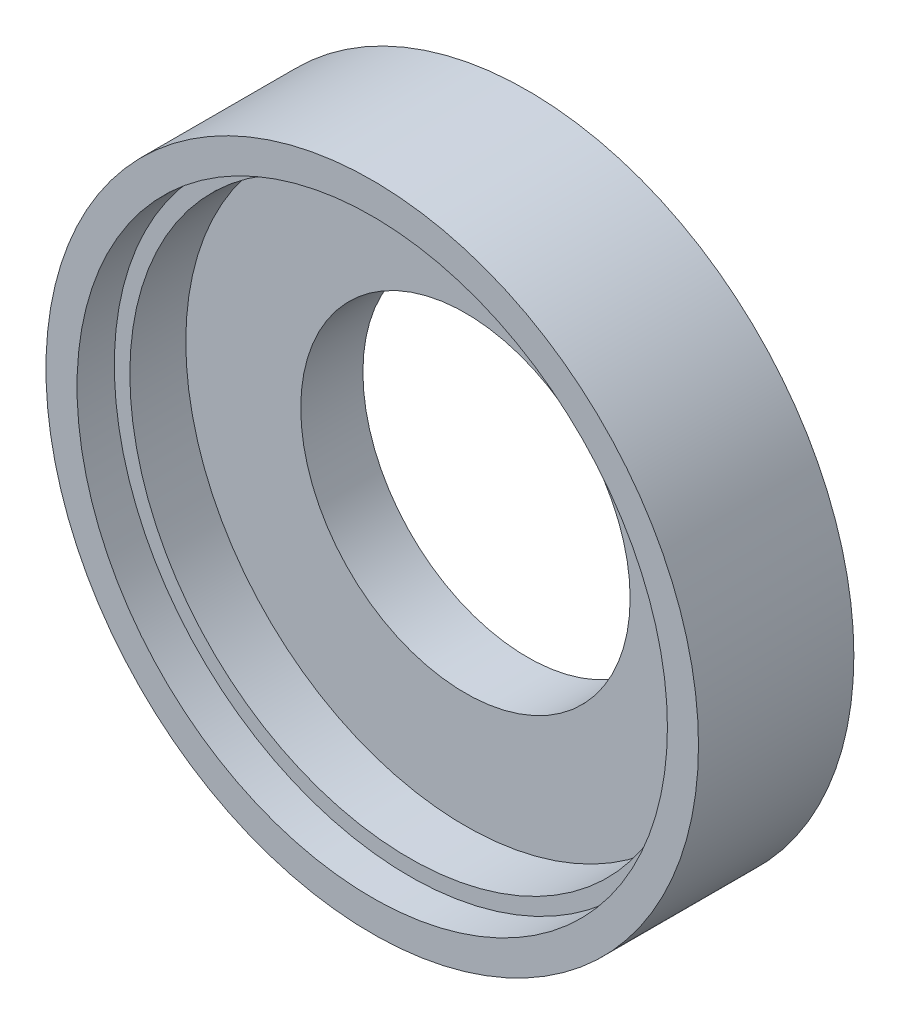
ISO-10303-21;
HEADER;
FILE_DESCRIPTION(('STEP AP214'),'2;1');
FILE_NAME('part.step','',(''),(''),'','','');
FILE_SCHEMA(('AUTOMOTIVE_DESIGN { 1 0 10303 214 1 1 1 1 }'));
ENDSEC;
DATA;
#1=APPLICATION_CONTEXT('core data for automotive mechanical design processes');
#2=APPLICATION_PROTOCOL_DEFINITION('international standard','automotive_design',2000,#1);
#3=PRODUCT_CONTEXT('',#1,'mechanical');
#4=PRODUCT('Part','Part','',(#3));
#5=PRODUCT_RELATED_PRODUCT_CATEGORY('part','',(#4));
#6=PRODUCT_DEFINITION_FORMATION('','',#4);
#7=PRODUCT_DEFINITION_CONTEXT('part definition',#1,'design');
#8=PRODUCT_DEFINITION('design','',#6,#7);
#9=PRODUCT_DEFINITION_SHAPE('','',#8);
#10=(LENGTH_UNIT() NAMED_UNIT(*) SI_UNIT(.MILLI.,.METRE.));
#11=(NAMED_UNIT(*) PLANE_ANGLE_UNIT() SI_UNIT($,.RADIAN.));
#12=(NAMED_UNIT(*) SI_UNIT($,.STERADIAN.) SOLID_ANGLE_UNIT());
#13=UNCERTAINTY_MEASURE_WITH_UNIT(LENGTH_MEASURE(1.E-05),#10,'distance_accuracy_value','');
#14=(GEOMETRIC_REPRESENTATION_CONTEXT(3) GLOBAL_UNCERTAINTY_ASSIGNED_CONTEXT((#13)) GLOBAL_UNIT_ASSIGNED_CONTEXT((#10,
#11,#12)) REPRESENTATION_CONTEXT('',''));
#15=CARTESIAN_POINT('',(0.,0.,0.));
#16=DIRECTION('',(0.,0.,1.));
#17=DIRECTION('',(1.,0.,0.));
#18=AXIS2_PLACEMENT_3D('',#15,#16,#17);
#19=CARTESIAN_POINT('',(0.,0.,25.));
#20=DIRECTION('',(0.,0.,-1.));
#21=DIRECTION('',(-1.,0.,0.));
#22=AXIS2_PLACEMENT_3D('',#19,#20,#21);
#23=CYLINDRICAL_SURFACE('',#22,47.5);
#24=CARTESIAN_POINT('',(0.,0.,19.));
#25=DIRECTION('',(0.,0.,1.));
#26=DIRECTION('',(1.,0.,0.));
#27=AXIS2_PLACEMENT_3D('',#24,#25,#26);
#28=CIRCLE('',#27,47.5);
#29=CARTESIAN_POINT('',(47.5,0.,19.));
#30=VERTEX_POINT('',#29);
#31=EDGE_CURVE('E43',#30,#30,#28,.T.);
#32=ORIENTED_EDGE('',*,*,#31,.F.);
#33=EDGE_LOOP('',(#32));
#34=FACE_BOUND('',#33,.T.);
#35=CARTESIAN_POINT('',(0.,0.,25.));
#36=DIRECTION('',(0.,0.,1.));
#37=DIRECTION('',(1.,0.,0.));
#38=AXIS2_PLACEMENT_3D('',#35,#36,#37);
#39=CIRCLE('',#38,47.5);
#40=CARTESIAN_POINT('',(47.5,0.,25.));
#41=VERTEX_POINT('',#40);
#42=EDGE_CURVE('E51',#41,#41,#39,.T.);
#43=ORIENTED_EDGE('',*,*,#42,.T.);
#44=EDGE_LOOP('',(#43));
#45=FACE_BOUND('',#44,.T.);
#46=ADVANCED_FACE('F37',(#34,#45),#23,.F.);
#47=CARTESIAN_POINT('',(0.,0.,25.));
#48=DIRECTION('',(0.,0.,-1.));
#49=DIRECTION('',(-1.,0.,0.));
#50=AXIS2_PLACEMENT_3D('',#47,#48,#49);
#51=CYLINDRICAL_SURFACE('',#50,52.5);
#52=CARTESIAN_POINT('',(0.,0.,25.));
#53=DIRECTION('',(0.,0.,1.));
#54=DIRECTION('',(1.,0.,0.));
#55=AXIS2_PLACEMENT_3D('',#52,#53,#54);
#56=CIRCLE('',#55,52.5);
#57=CARTESIAN_POINT('',(52.5,0.,25.));
#58=VERTEX_POINT('',#57);
#59=EDGE_CURVE('E47',#58,#58,#56,.T.);
#60=ORIENTED_EDGE('',*,*,#59,.F.);
#61=EDGE_LOOP('',(#60));
#62=FACE_BOUND('',#61,.T.);
#63=CARTESIAN_POINT('',(0.,0.,0.));
#64=DIRECTION('',(0.,0.,1.));
#65=DIRECTION('',(1.,0.,0.));
#66=AXIS2_PLACEMENT_3D('',#63,#64,#65);
#67=CIRCLE('',#66,52.5);
#68=CARTESIAN_POINT('',(52.5,0.,0.));
#69=VERTEX_POINT('',#68);
#70=EDGE_CURVE('E54',#69,#69,#67,.T.);
#71=ORIENTED_EDGE('',*,*,#70,.T.);
#72=EDGE_LOOP('',(#71));
#73=FACE_BOUND('',#72,.T.);
#74=ADVANCED_FACE('F81',(#62,#73),#51,.T.);
#75=CARTESIAN_POINT('',(0.,0.,25.));
#76=DIRECTION('',(0.,0.,1.));
#77=DIRECTION('',(1.,0.,0.));
#78=AXIS2_PLACEMENT_3D('',#75,#76,#77);
#79=PLANE('',#78);
#80=ORIENTED_EDGE('',*,*,#42,.F.);
#81=EDGE_LOOP('',(#80));
#82=FACE_BOUND('',#81,.T.);
#83=ORIENTED_EDGE('',*,*,#59,.T.);
#84=EDGE_LOOP('',(#83));
#85=FACE_BOUND('',#84,.T.);
#86=ADVANCED_FACE('F86',(#82,#85),#79,.T.);
#87=CARTESIAN_POINT('',(0.,0.,0.));
#88=DIRECTION('',(0.,0.,1.));
#89=DIRECTION('',(1.,0.,0.));
#90=AXIS2_PLACEMENT_3D('',#87,#88,#89);
#91=PLANE('',#90);
#92=ORIENTED_EDGE('',*,*,#70,.F.);
#93=EDGE_LOOP('',(#92));
#94=FACE_BOUND('',#93,.T.);
#95=CARTESIAN_POINT('',(0.,0.,0.));
#96=DIRECTION('',(0.,0.,1.));
#97=DIRECTION('',(1.,0.,0.));
#98=AXIS2_PLACEMENT_3D('',#95,#96,#97);
#99=CIRCLE('',#98,26.5);
#100=CARTESIAN_POINT('',(26.5,0.,0.));
#101=VERTEX_POINT('',#100);
#102=EDGE_CURVE('E63',#101,#101,#99,.T.);
#103=ORIENTED_EDGE('',*,*,#102,.T.);
#104=EDGE_LOOP('',(#103));
#105=FACE_BOUND('',#104,.T.);
#106=ADVANCED_FACE('F93',(#94,#105),#91,.F.);
#107=CARTESIAN_POINT('',(0.,0.,19.));
#108=DIRECTION('',(0.,0.,-1.));
#109=DIRECTION('',(-1.,0.,0.));
#110=AXIS2_PLACEMENT_3D('',#107,#108,#109);
#111=CYLINDRICAL_SURFACE('',#110,45.);
#112=CARTESIAN_POINT('',(0.,0.,10.));
#113=DIRECTION('',(0.,0.,1.));
#114=DIRECTION('',(1.,0.,0.));
#115=AXIS2_PLACEMENT_3D('',#112,#113,#114);
#116=CIRCLE('',#115,45.);
#117=CARTESIAN_POINT('',(45.,0.,10.));
#118=VERTEX_POINT('',#117);
#119=EDGE_CURVE('E10',#118,#118,#116,.T.);
#120=ORIENTED_EDGE('',*,*,#119,.F.);
#121=EDGE_LOOP('',(#120));
#122=FACE_BOUND('',#121,.T.);
#123=CARTESIAN_POINT('',(0.,0.,19.));
#124=DIRECTION('',(0.,0.,1.));
#125=DIRECTION('',(1.,0.,0.));
#126=AXIS2_PLACEMENT_3D('',#123,#124,#125);
#127=CIRCLE('',#126,45.);
#128=CARTESIAN_POINT('',(45.,0.,19.));
#129=VERTEX_POINT('',#128);
#130=EDGE_CURVE('E56',#129,#129,#127,.T.);
#131=ORIENTED_EDGE('',*,*,#130,.T.);
#132=EDGE_LOOP('',(#131));
#133=FACE_BOUND('',#132,.T.);
#134=ADVANCED_FACE('F101',(#122,#133),#111,.F.);
#135=CARTESIAN_POINT('',(0.,0.,19.));
#136=DIRECTION('',(0.,0.,1.));
#137=DIRECTION('',(1.,0.,0.));
#138=AXIS2_PLACEMENT_3D('',#135,#136,#137);
#139=PLANE('',#138);
#140=ORIENTED_EDGE('',*,*,#130,.F.);
#141=EDGE_LOOP('',(#140));
#142=FACE_BOUND('',#141,.T.);
#143=ORIENTED_EDGE('',*,*,#31,.T.);
#144=EDGE_LOOP('',(#143));
#145=FACE_BOUND('',#144,.T.);
#146=ADVANCED_FACE('F78',(#142,#145),#139,.T.);
#147=CARTESIAN_POINT('',(0.,0.,10.));
#148=DIRECTION('',(0.,0.,-1.));
#149=DIRECTION('',(-1.,0.,0.));
#150=AXIS2_PLACEMENT_3D('',#147,#148,#149);
#151=CYLINDRICAL_SURFACE('',#150,26.5);
#152=CARTESIAN_POINT('',(0.,0.,10.));
#153=DIRECTION('',(0.,0.,1.));
#154=DIRECTION('',(1.,0.,0.));
#155=AXIS2_PLACEMENT_3D('',#152,#153,#154);
#156=CIRCLE('',#155,26.5);
#157=CARTESIAN_POINT('',(26.5,0.,10.));
#158=VERTEX_POINT('',#157);
#159=EDGE_CURVE('E62',#158,#158,#156,.T.);
#160=ORIENTED_EDGE('',*,*,#159,.T.);
#161=EDGE_LOOP('',(#160));
#162=FACE_BOUND('',#161,.T.);
#163=ORIENTED_EDGE('',*,*,#102,.F.);
#164=EDGE_LOOP('',(#163));
#165=FACE_BOUND('',#164,.T.);
#166=ADVANCED_FACE('F69',(#162,#165),#151,.F.);
#167=CARTESIAN_POINT('',(0.,0.,10.));
#168=DIRECTION('',(0.,0.,1.));
#169=DIRECTION('',(1.,0.,0.));
#170=AXIS2_PLACEMENT_3D('',#167,#168,#169);
#171=PLANE('',#170);
#172=ORIENTED_EDGE('',*,*,#159,.F.);
#173=EDGE_LOOP('',(#172));
#174=FACE_BOUND('',#173,.T.);
#175=ORIENTED_EDGE('',*,*,#119,.T.);
#176=EDGE_LOOP('',(#175));
#177=FACE_BOUND('',#176,.T.);
#178=ADVANCED_FACE('F72',(#174,#177),#171,.T.);
#179=CLOSED_SHELL('',(#46,#74,#86,#106,#134,#146,#166,#178));
#180=MANIFOLD_SOLID_BREP('B2',#179);
#181=ADVANCED_BREP_SHAPE_REPRESENTATION('',(#18,#180),#14);
#182=SHAPE_DEFINITION_REPRESENTATION(#9,#181);
ENDSEC;
END-ISO-10303-21;
